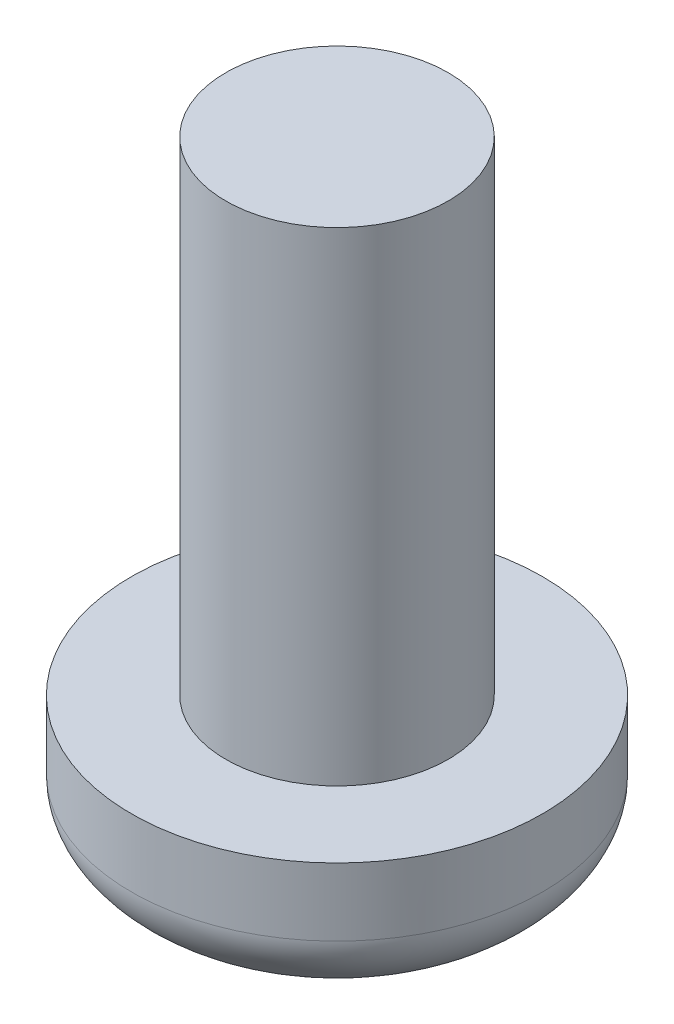
ISO-10303-21;
HEADER;
FILE_DESCRIPTION(('STEP AP214'),'2;1');
FILE_NAME('part.step','',(''),(''),'','','');
FILE_SCHEMA(('AUTOMOTIVE_DESIGN { 1 0 10303 214 1 1 1 1 }'));
ENDSEC;
DATA;
#1=APPLICATION_CONTEXT('core data for automotive mechanical design processes');
#2=APPLICATION_PROTOCOL_DEFINITION('international standard','automotive_design',2000,#1);
#3=PRODUCT_CONTEXT('',#1,'mechanical');
#4=PRODUCT('Part','Part','',(#3));
#5=PRODUCT_RELATED_PRODUCT_CATEGORY('part','',(#4));
#6=PRODUCT_DEFINITION_FORMATION('','',#4);
#7=PRODUCT_DEFINITION_CONTEXT('part definition',#1,'design');
#8=PRODUCT_DEFINITION('design','',#6,#7);
#9=PRODUCT_DEFINITION_SHAPE('','',#8);
#10=(LENGTH_UNIT() NAMED_UNIT(*) SI_UNIT(.MILLI.,.METRE.));
#11=(NAMED_UNIT(*) PLANE_ANGLE_UNIT() SI_UNIT($,.RADIAN.));
#12=(NAMED_UNIT(*) SI_UNIT($,.STERADIAN.) SOLID_ANGLE_UNIT());
#13=UNCERTAINTY_MEASURE_WITH_UNIT(LENGTH_MEASURE(1.E-05),#10,'distance_accuracy_value','');
#14=(GEOMETRIC_REPRESENTATION_CONTEXT(3) GLOBAL_UNCERTAINTY_ASSIGNED_CONTEXT((#13)) GLOBAL_UNIT_ASSIGNED_CONTEXT((#10,
#11,#12)) REPRESENTATION_CONTEXT('',''));
#15=CARTESIAN_POINT('',(0.,0.,0.));
#16=DIRECTION('',(0.,0.,1.));
#17=DIRECTION('',(1.,0.,0.));
#18=AXIS2_PLACEMENT_3D('',#15,#16,#17);
#19=CARTESIAN_POINT('',(0.,10.,0.));
#20=DIRECTION('',(0.,1.,0.));
#21=DIRECTION('',(0.,0.,1.));
#22=AXIS2_PLACEMENT_3D('',#19,#20,#21);
#23=PLANE('',#22);
#24=CARTESIAN_POINT('',(0.,10.,0.));
#25=DIRECTION('',(0.,-1.,0.));
#26=DIRECTION('',(0.,0.,-1.));
#27=AXIS2_PLACEMENT_3D('',#24,#25,#26);
#28=CIRCLE('',#27,2.3);
#29=CARTESIAN_POINT('',(0.,10.,-2.3));
#30=VERTEX_POINT('',#29);
#31=EDGE_CURVE('E11',#30,#30,#28,.T.);
#32=ORIENTED_EDGE('',*,*,#31,.F.);
#33=EDGE_LOOP('',(#32));
#34=FACE_BOUND('',#33,.T.);
#35=ADVANCED_FACE('F33',(#34),#23,.T.);
#36=CARTESIAN_POINT('',(0.,-1.13484646194936,0.));
#37=DIRECTION('',(0.,-1.,0.));
#38=DIRECTION('',(0.,0.,-1.));
#39=AXIS2_PLACEMENT_3D('',#36,#37,#38);
#40=CYLINDRICAL_SURFACE('',#39,2.3);
#41=ORIENTED_EDGE('',*,*,#31,.T.);
#42=EDGE_LOOP('',(#41));
#43=FACE_BOUND('',#42,.T.);
#44=CARTESIAN_POINT('',(0.,0.,0.));
#45=DIRECTION('',(0.,-1.,0.));
#46=DIRECTION('',(0.,0.,-1.));
#47=AXIS2_PLACEMENT_3D('',#44,#45,#46);
#48=CIRCLE('',#47,2.3);
#49=CARTESIAN_POINT('',(0.,0.,-2.3));
#50=VERTEX_POINT('',#49);
#51=EDGE_CURVE('E39',#50,#50,#48,.T.);
#52=ORIENTED_EDGE('',*,*,#51,.F.);
#53=EDGE_LOOP('',(#52));
#54=FACE_BOUND('',#53,.T.);
#55=ADVANCED_FACE('F56',(#43,#54),#40,.T.);
#56=CARTESIAN_POINT('',(2.3,0.,0.));
#57=DIRECTION('',(0.,1.,0.));
#58=DIRECTION('',(0.,0.,1.));
#59=AXIS2_PLACEMENT_3D('',#56,#57,#58);
#60=PLANE('',#59);
#61=ORIENTED_EDGE('',*,*,#51,.T.);
#62=EDGE_LOOP('',(#61));
#63=FACE_BOUND('',#62,.T.);
#64=CARTESIAN_POINT('',(0.,0.,0.));
#65=DIRECTION('',(0.,-1.,0.));
#66=DIRECTION('',(0.,0.,-1.));
#67=AXIS2_PLACEMENT_3D('',#64,#65,#66);
#68=CIRCLE('',#67,4.25);
#69=CARTESIAN_POINT('',(0.,0.,-4.25));
#70=VERTEX_POINT('',#69);
#71=EDGE_CURVE('E67',#70,#70,#68,.T.);
#72=ORIENTED_EDGE('',*,*,#71,.F.);
#73=EDGE_LOOP('',(#72));
#74=FACE_BOUND('',#73,.T.);
#75=ADVANCED_FACE('F50',(#63,#74),#60,.T.);
#76=CARTESIAN_POINT('',(0.,-1.13484646194936,0.));
#77=DIRECTION('',(0.,-1.,0.));
#78=DIRECTION('',(0.,0.,-1.));
#79=AXIS2_PLACEMENT_3D('',#76,#77,#78);
#80=CYLINDRICAL_SURFACE('',#79,4.25);
#81=ORIENTED_EDGE('',*,*,#71,.T.);
#82=EDGE_LOOP('',(#81));
#83=FACE_BOUND('',#82,.T.);
#84=CARTESIAN_POINT('',(0.,-1.4,0.));
#85=DIRECTION('',(0.,-1.,0.));
#86=DIRECTION('',(0.,0.,-1.));
#87=AXIS2_PLACEMENT_3D('',#84,#85,#86);
#88=CIRCLE('',#87,4.25);
#89=CARTESIAN_POINT('',(0.,-1.4,-4.25));
#90=VERTEX_POINT('',#89);
#91=EDGE_CURVE('E69',#90,#90,#88,.T.);
#92=ORIENTED_EDGE('',*,*,#91,.F.);
#93=EDGE_LOOP('',(#92));
#94=FACE_BOUND('',#93,.T.);
#95=ADVANCED_FACE('F44',(#83,#94),#80,.T.);
#96=CARTESIAN_POINT('',(0.,-1.4,0.));
#97=DIRECTION('',(0.,0.,1.));
#98=DIRECTION('',(1.,0.,0.));
#99=AXIS2_PLACEMENT_3D('',#96,#97,#98);
#100=ELLIPSE('',#99,4.25,2.1);
#101=TRIMMED_CURVE('',#100,(PARAMETER_VALUE(4.71238898038469)),
(PARAMETER_VALUE(7.85398163397448)),.T.,.PARAMETER.);
#102=CARTESIAN_POINT('',(0.,-1.13484646194936,0.));
#103=DIRECTION('',(0.,-1.,0.));
#104=AXIS1_PLACEMENT('',#102,#103);
#105=SURFACE_OF_REVOLUTION('',#101,#104);
#106=ORIENTED_EDGE('',*,*,#91,.T.);
#107=EDGE_LOOP('',(#106));
#108=FACE_BOUND('',#107,.T.);
#109=CARTESIAN_POINT('',(0.,-3.5,0.));
#110=VERTEX_POINT('',#109);
#111=VERTEX_LOOP('',#110);
#112=FACE_BOUND('',#111,.T.);
#113=ADVANCED_FACE('F42',(#108,#112),#105,.F.);
#114=CLOSED_SHELL('',(#35,#55,#75,#95,#113));
#115=MANIFOLD_SOLID_BREP('B2',#114);
#116=ADVANCED_BREP_SHAPE_REPRESENTATION('',(#18,#115),#14);
#117=SHAPE_DEFINITION_REPRESENTATION(#9,#116);
ENDSEC;
END-ISO-10303-21;
